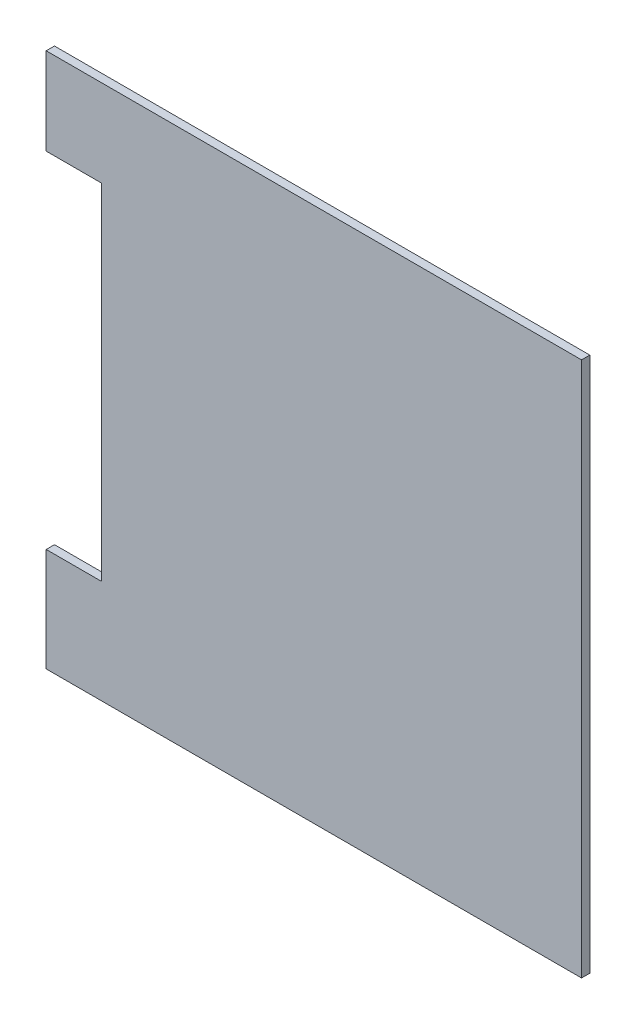
ISO-10303-21;
HEADER;
FILE_DESCRIPTION(('STEP AP214'),'2;1');
FILE_NAME('part.step','',(''),(''),'','','');
FILE_SCHEMA(('AUTOMOTIVE_DESIGN { 1 0 10303 214 1 1 1 1 }'));
ENDSEC;
DATA;
#1=APPLICATION_CONTEXT('core data for automotive mechanical design processes');
#2=APPLICATION_PROTOCOL_DEFINITION('international standard','automotive_design',2000,#1);
#3=PRODUCT_CONTEXT('',#1,'mechanical');
#4=PRODUCT('Part','Part','',(#3));
#5=PRODUCT_RELATED_PRODUCT_CATEGORY('part','',(#4));
#6=PRODUCT_DEFINITION_FORMATION('','',#4);
#7=PRODUCT_DEFINITION_CONTEXT('part definition',#1,'design');
#8=PRODUCT_DEFINITION('design','',#6,#7);
#9=PRODUCT_DEFINITION_SHAPE('','',#8);
#10=(LENGTH_UNIT() NAMED_UNIT(*) SI_UNIT(.MILLI.,.METRE.));
#11=(NAMED_UNIT(*) PLANE_ANGLE_UNIT() SI_UNIT($,.RADIAN.));
#12=(NAMED_UNIT(*) SI_UNIT($,.STERADIAN.) SOLID_ANGLE_UNIT());
#13=UNCERTAINTY_MEASURE_WITH_UNIT(LENGTH_MEASURE(1.E-05),#10,'distance_accuracy_value','');
#14=(GEOMETRIC_REPRESENTATION_CONTEXT(3) GLOBAL_UNCERTAINTY_ASSIGNED_CONTEXT((#13)) GLOBAL_UNIT_ASSIGNED_CONTEXT((#10,
#11,#12)) REPRESENTATION_CONTEXT('',''));
#15=CARTESIAN_POINT('',(0.,0.,0.));
#16=DIRECTION('',(0.,0.,1.));
#17=DIRECTION('',(1.,0.,0.));
#18=AXIS2_PLACEMENT_3D('',#15,#16,#17);
#19=CARTESIAN_POINT('',(-28.5714285714286,365.104761904762,6.));
#20=DIRECTION('',(1.,0.,0.));
#21=DIRECTION('',(0.,1.,0.));
#22=AXIS2_PLACEMENT_3D('',#19,#20,#21);
#23=PLANE('',#22);
#24=DIRECTION('',(0.,-1.,0.));
#25=VECTOR('',#24,1.);
#26=CARTESIAN_POINT('',(-28.5714285714286,365.104761904762,0.));
#27=LINE('',#26,#25);
#28=CARTESIAN_POINT('',(-28.5714285714286,365.104761904762,0.));
#29=VERTEX_POINT('',#28);
#30=CARTESIAN_POINT('',(-28.5714285714286,302.104761904762,0.));
#31=VERTEX_POINT('',#30);
#32=EDGE_CURVE('E136',#29,#31,#27,.T.);
#33=ORIENTED_EDGE('',*,*,#32,.T.);
#34=DIRECTION('',(0.,0.,1.));
#35=VECTOR('',#34,1.);
#36=CARTESIAN_POINT('',(-28.5714285714286,302.104761904762,-4.));
#37=LINE('',#36,#35);
#38=CARTESIAN_POINT('',(-28.5714285714286,302.104761904762,6.));
#39=VERTEX_POINT('',#38);
#40=EDGE_CURVE('E159',#31,#39,#37,.T.);
#41=ORIENTED_EDGE('',*,*,#40,.T.);
#42=DIRECTION('',(0.,-1.,0.));
#43=VECTOR('',#42,1.);
#44=CARTESIAN_POINT('',(-28.5714285714286,365.104761904762,6.));
#45=LINE('',#44,#43);
#46=CARTESIAN_POINT('',(-28.5714285714286,365.104761904762,6.));
#47=VERTEX_POINT('',#46);
#48=EDGE_CURVE('E124',#47,#39,#45,.T.);
#49=ORIENTED_EDGE('',*,*,#48,.F.);
#50=DIRECTION('',(0.,0.,-1.));
#51=VECTOR('',#50,1.);
#52=CARTESIAN_POINT('',(-28.5714285714286,365.104761904762,6.));
#53=LINE('',#52,#51);
#54=EDGE_CURVE('E135',#47,#29,#53,.T.);
#55=ORIENTED_EDGE('',*,*,#54,.T.);
#56=EDGE_LOOP('',(#33,#41,#49,#55));
#57=FACE_BOUND('',#56,.T.);
#58=ADVANCED_FACE('F33',(#57),#23,.F.);
#59=CARTESIAN_POINT('',(-28.5714285714286,52.1047619047619,6.));
#60=VERTEX_POINT('',#59);
#61=CARTESIAN_POINT('',(-28.5714285714286,-22.8952380952381,6.));
#62=VERTEX_POINT('',#61);
#63=EDGE_CURVE('E85',#60,#62,#45,.T.);
#64=ORIENTED_EDGE('',*,*,#63,.F.);
#65=DIRECTION('',(0.,0.,1.));
#66=VECTOR('',#65,1.);
#67=CARTESIAN_POINT('',(-28.5714285714286,52.1047619047619,-4.));
#68=LINE('',#67,#66);
#69=CARTESIAN_POINT('',(-28.5714285714286,52.1047619047619,0.));
#70=VERTEX_POINT('',#69);
#71=EDGE_CURVE('E106',#70,#60,#68,.T.);
#72=ORIENTED_EDGE('',*,*,#71,.F.);
#73=CARTESIAN_POINT('',(-28.5714285714286,-22.8952380952381,0.));
#74=VERTEX_POINT('',#73);
#75=EDGE_CURVE('E140',#70,#74,#27,.T.);
#76=ORIENTED_EDGE('',*,*,#75,.T.);
#77=DIRECTION('',(0.,0.,-1.));
#78=VECTOR('',#77,1.);
#79=CARTESIAN_POINT('',(-28.5714285714286,-22.8952380952381,6.));
#80=LINE('',#79,#78);
#81=EDGE_CURVE('E123',#62,#74,#80,.T.);
#82=ORIENTED_EDGE('',*,*,#81,.F.);
#83=EDGE_LOOP('',(#64,#72,#76,#82));
#84=FACE_BOUND('',#83,.T.);
#85=ADVANCED_FACE('F35',(#84),#23,.F.);
#86=CARTESIAN_POINT('',(-28.5714285714286,-22.8952380952381,6.));
#87=DIRECTION('',(0.,1.,0.));
#88=DIRECTION('',(0.,0.,1.));
#89=AXIS2_PLACEMENT_3D('',#86,#87,#88);
#90=PLANE('',#89);
#91=DIRECTION('',(1.,0.,0.));
#92=VECTOR('',#91,1.);
#93=CARTESIAN_POINT('',(-28.5714285714286,-22.8952380952381,0.));
#94=LINE('',#93,#92);
#95=CARTESIAN_POINT('',(359.428571428571,-22.8952380952381,0.));
#96=VERTEX_POINT('',#95);
#97=EDGE_CURVE('E139',#74,#96,#94,.T.);
#98=ORIENTED_EDGE('',*,*,#97,.T.);
#99=DIRECTION('',(0.,0.,-1.));
#100=VECTOR('',#99,1.);
#101=CARTESIAN_POINT('',(359.428571428571,-22.8952380952381,6.));
#102=LINE('',#101,#100);
#103=CARTESIAN_POINT('',(359.428571428571,-22.8952380952381,6.));
#104=VERTEX_POINT('',#103);
#105=EDGE_CURVE('E146',#104,#96,#102,.T.);
#106=ORIENTED_EDGE('',*,*,#105,.F.);
#107=DIRECTION('',(1.,0.,0.));
#108=VECTOR('',#107,1.);
#109=CARTESIAN_POINT('',(-28.5714285714286,-22.8952380952381,6.));
#110=LINE('',#109,#108);
#111=EDGE_CURVE('E126',#62,#104,#110,.T.);
#112=ORIENTED_EDGE('',*,*,#111,.F.);
#113=ORIENTED_EDGE('',*,*,#81,.T.);
#114=EDGE_LOOP('',(#98,#106,#112,#113));
#115=FACE_BOUND('',#114,.T.);
#116=ADVANCED_FACE('F183',(#115),#90,.F.);
#117=CARTESIAN_POINT('',(359.428571428571,365.104761904762,6.));
#118=DIRECTION('',(-1.,0.,0.));
#119=DIRECTION('',(0.,-1.,0.));
#120=AXIS2_PLACEMENT_3D('',#117,#118,#119);
#121=PLANE('',#120);
#122=DIRECTION('',(0.,1.,0.));
#123=VECTOR('',#122,1.);
#124=CARTESIAN_POINT('',(359.428571428571,365.104761904762,0.));
#125=LINE('',#124,#123);
#126=CARTESIAN_POINT('',(359.428571428571,365.104761904762,0.));
#127=VERTEX_POINT('',#126);
#128=EDGE_CURVE('E127',#96,#127,#125,.T.);
#129=ORIENTED_EDGE('',*,*,#128,.T.);
#130=DIRECTION('',(0.,0.,-1.));
#131=VECTOR('',#130,1.);
#132=CARTESIAN_POINT('',(359.428571428571,365.104761904762,6.));
#133=LINE('',#132,#131);
#134=CARTESIAN_POINT('',(359.428571428571,365.104761904762,6.));
#135=VERTEX_POINT('',#134);
#136=EDGE_CURVE('E144',#135,#127,#133,.T.);
#137=ORIENTED_EDGE('',*,*,#136,.F.);
#138=DIRECTION('',(0.,1.,0.));
#139=VECTOR('',#138,1.);
#140=CARTESIAN_POINT('',(359.428571428571,365.104761904762,6.));
#141=LINE('',#140,#139);
#142=EDGE_CURVE('E132',#104,#135,#141,.T.);
#143=ORIENTED_EDGE('',*,*,#142,.F.);
#144=ORIENTED_EDGE('',*,*,#105,.T.);
#145=EDGE_LOOP('',(#129,#137,#143,#144));
#146=FACE_BOUND('',#145,.T.);
#147=ADVANCED_FACE('F172',(#146),#121,.F.);
#148=CARTESIAN_POINT('',(-28.5714285714286,365.104761904762,6.));
#149=DIRECTION('',(0.,-1.,0.));
#150=DIRECTION('',(0.,0.,-1.));
#151=AXIS2_PLACEMENT_3D('',#148,#149,#150);
#152=PLANE('',#151);
#153=DIRECTION('',(-1.,0.,0.));
#154=VECTOR('',#153,1.);
#155=CARTESIAN_POINT('',(-28.5714285714286,365.104761904762,0.));
#156=LINE('',#155,#154);
#157=EDGE_CURVE('E78',#127,#29,#156,.T.);
#158=ORIENTED_EDGE('',*,*,#157,.T.);
#159=ORIENTED_EDGE('',*,*,#54,.F.);
#160=DIRECTION('',(-1.,0.,0.));
#161=VECTOR('',#160,1.);
#162=CARTESIAN_POINT('',(-28.5714285714286,365.104761904762,6.));
#163=LINE('',#162,#161);
#164=EDGE_CURVE('E57',#135,#47,#163,.T.);
#165=ORIENTED_EDGE('',*,*,#164,.F.);
#166=ORIENTED_EDGE('',*,*,#136,.T.);
#167=EDGE_LOOP('',(#158,#159,#165,#166));
#168=FACE_BOUND('',#167,.T.);
#169=ADVANCED_FACE('F175',(#168),#152,.F.);
#170=CARTESIAN_POINT('',(0.,0.,6.));
#171=DIRECTION('',(0.,0.,1.));
#172=DIRECTION('',(1.,0.,0.));
#173=AXIS2_PLACEMENT_3D('',#170,#171,#172);
#174=PLANE('',#173);
#175=DIRECTION('',(-1.,0.,0.));
#176=VECTOR('',#175,1.);
#177=CARTESIAN_POINT('',(-28.5714285714286,302.104761904762,6.));
#178=LINE('',#177,#176);
#179=CARTESIAN_POINT('',(11.4285714285714,302.104761904762,6.));
#180=VERTEX_POINT('',#179);
#181=EDGE_CURVE('E114',#180,#39,#178,.T.);
#182=ORIENTED_EDGE('',*,*,#181,.F.);
#183=DIRECTION('',(0.,1.,0.));
#184=VECTOR('',#183,1.);
#185=CARTESIAN_POINT('',(11.4285714285714,302.104761904762,6.));
#186=LINE('',#185,#184);
#187=CARTESIAN_POINT('',(11.4285714285714,52.1047619047619,6.));
#188=VERTEX_POINT('',#187);
#189=EDGE_CURVE('E119',#188,#180,#186,.T.);
#190=ORIENTED_EDGE('',*,*,#189,.F.);
#191=DIRECTION('',(1.,0.,0.));
#192=VECTOR('',#191,1.);
#193=CARTESIAN_POINT('',(-28.5714285714286,52.1047619047619,6.));
#194=LINE('',#193,#192);
#195=EDGE_CURVE('E108',#60,#188,#194,.T.);
#196=ORIENTED_EDGE('',*,*,#195,.F.);
#197=ORIENTED_EDGE('',*,*,#63,.T.);
#198=ORIENTED_EDGE('',*,*,#111,.T.);
#199=ORIENTED_EDGE('',*,*,#142,.T.);
#200=ORIENTED_EDGE('',*,*,#164,.T.);
#201=ORIENTED_EDGE('',*,*,#48,.T.);
#202=EDGE_LOOP('',(#182,#190,#196,#197,#198,#199,#200,#201));
#203=FACE_BOUND('',#202,.T.);
#204=ADVANCED_FACE('F117',(#203),#174,.T.);
#205=CARTESIAN_POINT('',(0.,0.,0.));
#206=DIRECTION('',(0.,0.,1.));
#207=DIRECTION('',(1.,0.,0.));
#208=AXIS2_PLACEMENT_3D('',#205,#206,#207);
#209=PLANE('',#208);
#210=DIRECTION('',(0.,1.,0.));
#211=VECTOR('',#210,1.);
#212=CARTESIAN_POINT('',(11.4285714285714,0.,0.));
#213=LINE('',#212,#211);
#214=CARTESIAN_POINT('',(11.4285714285714,52.1047619047619,0.));
#215=VERTEX_POINT('',#214);
#216=CARTESIAN_POINT('',(11.4285714285714,302.104761904762,0.));
#217=VERTEX_POINT('',#216);
#218=EDGE_CURVE('E41',#215,#217,#213,.T.);
#219=ORIENTED_EDGE('',*,*,#218,.T.);
#220=DIRECTION('',(-1.,0.,0.));
#221=VECTOR('',#220,1.);
#222=CARTESIAN_POINT('',(0.,302.104761904762,0.));
#223=LINE('',#222,#221);
#224=EDGE_CURVE('E11',#217,#31,#223,.T.);
#225=ORIENTED_EDGE('',*,*,#224,.T.);
#226=ORIENTED_EDGE('',*,*,#32,.F.);
#227=ORIENTED_EDGE('',*,*,#157,.F.);
#228=ORIENTED_EDGE('',*,*,#128,.F.);
#229=ORIENTED_EDGE('',*,*,#97,.F.);
#230=ORIENTED_EDGE('',*,*,#75,.F.);
#231=DIRECTION('',(1.,0.,0.));
#232=VECTOR('',#231,1.);
#233=CARTESIAN_POINT('',(0.,52.1047619047619,0.));
#234=LINE('',#233,#232);
#235=EDGE_CURVE('E111',#70,#215,#234,.T.);
#236=ORIENTED_EDGE('',*,*,#235,.T.);
#237=EDGE_LOOP('',(#219,#225,#226,#227,#228,#229,#230,#236));
#238=FACE_BOUND('',#237,.T.);
#239=ADVANCED_FACE('F152',(#238),#209,.F.);
#240=CARTESIAN_POINT('',(-28.5714285714286,302.104761904762,-4.));
#241=DIRECTION('',(0.,1.,0.));
#242=DIRECTION('',(0.,0.,1.));
#243=AXIS2_PLACEMENT_3D('',#240,#241,#242);
#244=PLANE('',#243);
#245=DIRECTION('',(0.,0.,1.));
#246=VECTOR('',#245,1.);
#247=CARTESIAN_POINT('',(11.4285714285714,302.104761904762,-4.));
#248=LINE('',#247,#246);
#249=EDGE_CURVE('E157',#217,#180,#248,.T.);
#250=ORIENTED_EDGE('',*,*,#249,.T.);
#251=ORIENTED_EDGE('',*,*,#181,.T.);
#252=ORIENTED_EDGE('',*,*,#40,.F.);
#253=ORIENTED_EDGE('',*,*,#224,.F.);
#254=EDGE_LOOP('',(#250,#251,#252,#253));
#255=FACE_BOUND('',#254,.T.);
#256=ADVANCED_FACE('F165',(#255),#244,.F.);
#257=CARTESIAN_POINT('',(11.4285714285714,302.104761904762,-4.));
#258=DIRECTION('',(1.,0.,0.));
#259=DIRECTION('',(0.,1.,0.));
#260=AXIS2_PLACEMENT_3D('',#257,#258,#259);
#261=PLANE('',#260);
#262=DIRECTION('',(0.,0.,1.));
#263=VECTOR('',#262,1.);
#264=CARTESIAN_POINT('',(11.4285714285714,52.1047619047619,-4.));
#265=LINE('',#264,#263);
#266=EDGE_CURVE('E48',#215,#188,#265,.T.);
#267=ORIENTED_EDGE('',*,*,#266,.T.);
#268=ORIENTED_EDGE('',*,*,#189,.T.);
#269=ORIENTED_EDGE('',*,*,#249,.F.);
#270=ORIENTED_EDGE('',*,*,#218,.F.);
#271=EDGE_LOOP('',(#267,#268,#269,#270));
#272=FACE_BOUND('',#271,.T.);
#273=ADVANCED_FACE('F156',(#272),#261,.F.);
#274=CARTESIAN_POINT('',(-28.5714285714286,52.1047619047619,-4.));
#275=DIRECTION('',(0.,-1.,0.));
#276=DIRECTION('',(0.,0.,-1.));
#277=AXIS2_PLACEMENT_3D('',#274,#275,#276);
#278=PLANE('',#277);
#279=ORIENTED_EDGE('',*,*,#71,.T.);
#280=ORIENTED_EDGE('',*,*,#195,.T.);
#281=ORIENTED_EDGE('',*,*,#266,.F.);
#282=ORIENTED_EDGE('',*,*,#235,.F.);
#283=EDGE_LOOP('',(#279,#280,#281,#282));
#284=FACE_BOUND('',#283,.T.);
#285=ADVANCED_FACE('F107',(#284),#278,.F.);
#286=CLOSED_SHELL('',(#58,#85,#116,#147,#169,#204,#239,#256,#273,#285));
#287=MANIFOLD_SOLID_BREP('B2',#286);
#288=ADVANCED_BREP_SHAPE_REPRESENTATION('',(#18,#287),#14);
#289=SHAPE_DEFINITION_REPRESENTATION(#9,#288);
ENDSEC;
END-ISO-10303-21;
